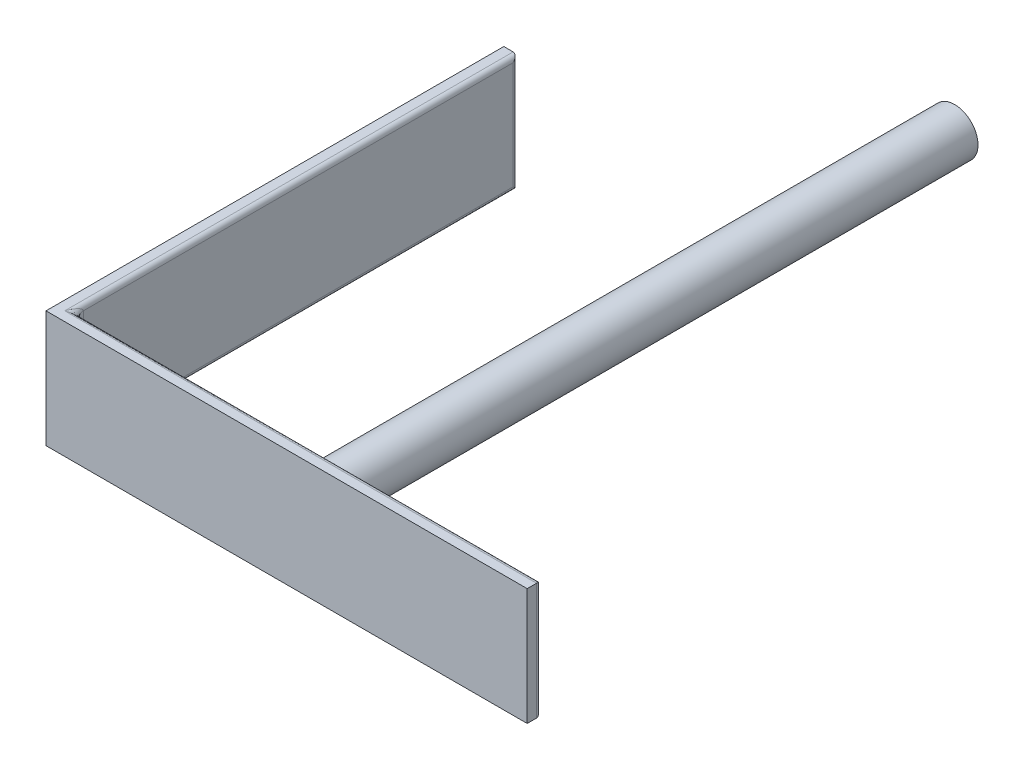
ISO-10303-21;
HEADER;
FILE_DESCRIPTION(('STEP AP214'),'2;1');
FILE_NAME('part.step','',(''),(''),'','','');
FILE_SCHEMA(('AUTOMOTIVE_DESIGN { 1 0 10303 214 1 1 1 1 }'));
ENDSEC;
DATA;
#1=APPLICATION_CONTEXT('core data for automotive mechanical design processes');
#2=APPLICATION_PROTOCOL_DEFINITION('international standard','automotive_design',2000,#1);
#3=PRODUCT_CONTEXT('',#1,'mechanical');
#4=PRODUCT('Part','Part','',(#3));
#5=PRODUCT_RELATED_PRODUCT_CATEGORY('part','',(#4));
#6=PRODUCT_DEFINITION_FORMATION('','',#4);
#7=PRODUCT_DEFINITION_CONTEXT('part definition',#1,'design');
#8=PRODUCT_DEFINITION('design','',#6,#7);
#9=PRODUCT_DEFINITION_SHAPE('','',#8);
#10=(LENGTH_UNIT() NAMED_UNIT(*) SI_UNIT(.MILLI.,.METRE.));
#11=(NAMED_UNIT(*) PLANE_ANGLE_UNIT() SI_UNIT($,.RADIAN.));
#12=(NAMED_UNIT(*) SI_UNIT($,.STERADIAN.) SOLID_ANGLE_UNIT());
#13=UNCERTAINTY_MEASURE_WITH_UNIT(LENGTH_MEASURE(1.E-05),#10,'distance_accuracy_value','');
#14=(GEOMETRIC_REPRESENTATION_CONTEXT(3) GLOBAL_UNCERTAINTY_ASSIGNED_CONTEXT((#13)) GLOBAL_UNIT_ASSIGNED_CONTEXT((#10,
#11,#12)) REPRESENTATION_CONTEXT('',''));
#15=CARTESIAN_POINT('',(0.,0.,0.));
#16=DIRECTION('',(0.,0.,1.));
#17=DIRECTION('',(1.,0.,0.));
#18=AXIS2_PLACEMENT_3D('',#15,#16,#17);
#19=CARTESIAN_POINT('',(0.,0.,140.));
#20=DIRECTION('',(0.,0.,-1.));
#21=DIRECTION('',(-1.,0.,0.));
#22=AXIS2_PLACEMENT_3D('',#19,#20,#21);
#23=CYLINDRICAL_SURFACE('',#22,5.);
#24=CARTESIAN_POINT('',(0.,0.,140.));
#25=DIRECTION('',(0.,0.,1.));
#26=DIRECTION('',(1.,0.,0.));
#27=AXIS2_PLACEMENT_3D('',#24,#25,#26);
#28=CIRCLE('',#27,5.);
#29=CARTESIAN_POINT('',(5.,0.,140.));
#30=VERTEX_POINT('',#29);
#31=EDGE_CURVE('E155',#30,#30,#28,.T.);
#32=ORIENTED_EDGE('',*,*,#31,.F.);
#33=EDGE_LOOP('',(#32));
#34=FACE_BOUND('',#33,.T.);
#35=CARTESIAN_POINT('',(0.,0.,0.));
#36=DIRECTION('',(0.,0.,1.));
#37=DIRECTION('',(1.,0.,0.));
#38=AXIS2_PLACEMENT_3D('',#35,#36,#37);
#39=CIRCLE('',#38,5.);
#40=CARTESIAN_POINT('',(5.,0.,0.));
#41=VERTEX_POINT('',#40);
#42=EDGE_CURVE('E152',#41,#41,#39,.T.);
#43=ORIENTED_EDGE('',*,*,#42,.T.);
#44=EDGE_LOOP('',(#43));
#45=FACE_BOUND('',#44,.T.);
#46=ADVANCED_FACE('F43',(#34,#45),#23,.T.);
#47=CARTESIAN_POINT('',(0.,0.,0.));
#48=DIRECTION('',(0.,0.,1.));
#49=DIRECTION('',(1.,0.,0.));
#50=AXIS2_PLACEMENT_3D('',#47,#48,#49);
#51=PLANE('',#50);
#52=ORIENTED_EDGE('',*,*,#42,.F.);
#53=EDGE_LOOP('',(#52));
#54=FACE_BOUND('',#53,.T.);
#55=ADVANCED_FACE('F240',(#54),#51,.F.);
#56=CARTESIAN_POINT('',(-48.5,12.5,45.));
#57=DIRECTION('',(0.,0.,1.));
#58=DIRECTION('',(1.,0.,0.));
#59=AXIS2_PLACEMENT_3D('',#56,#57,#58);
#60=PLANE('',#59);
#61=DIRECTION('',(-1.,0.,0.));
#62=VECTOR('',#61,1.);
#63=CARTESIAN_POINT('',(-48.5,12.5,45.));
#64=LINE('',#63,#62);
#65=CARTESIAN_POINT('',(-49.5,12.5,45.));
#66=VERTEX_POINT('',#65);
#67=CARTESIAN_POINT('',(-51.5,12.5,45.));
#68=VERTEX_POINT('',#67);
#69=EDGE_CURVE('E126',#66,#68,#64,.T.);
#70=ORIENTED_EDGE('',*,*,#69,.F.);
#71=DIRECTION('',(0.,-1.,0.));
#72=VECTOR('',#71,1.);
#73=CARTESIAN_POINT('',(-49.5,12.5,45.));
#74=LINE('',#73,#72);
#75=CARTESIAN_POINT('',(-49.5,-12.5,45.));
#76=VERTEX_POINT('',#75);
#77=EDGE_CURVE('E173',#66,#76,#74,.T.);
#78=ORIENTED_EDGE('',*,*,#77,.T.);
#79=DIRECTION('',(-1.,0.,0.));
#80=VECTOR('',#79,1.);
#81=CARTESIAN_POINT('',(-48.5,-12.5,45.));
#82=LINE('',#81,#80);
#83=CARTESIAN_POINT('',(-51.5,-12.5,45.));
#84=VERTEX_POINT('',#83);
#85=EDGE_CURVE('E150',#76,#84,#82,.T.);
#86=ORIENTED_EDGE('',*,*,#85,.T.);
#87=DIRECTION('',(0.,-1.,0.));
#88=VECTOR('',#87,1.);
#89=CARTESIAN_POINT('',(-51.5,12.5,45.));
#90=LINE('',#89,#88);
#91=EDGE_CURVE('E142',#68,#84,#90,.T.);
#92=ORIENTED_EDGE('',*,*,#91,.F.);
#93=EDGE_LOOP('',(#70,#78,#86,#92));
#94=FACE_BOUND('',#93,.T.);
#95=ADVANCED_FACE('F148',(#94),#60,.F.);
#96=CARTESIAN_POINT('',(-51.5,12.5,45.));
#97=DIRECTION('',(1.,0.,0.));
#98=DIRECTION('',(0.,0.,-1.));
#99=AXIS2_PLACEMENT_3D('',#96,#97,#98);
#100=PLANE('',#99);
#101=DIRECTION('',(0.,0.,1.));
#102=VECTOR('',#101,1.);
#103=CARTESIAN_POINT('',(-51.5,-12.5,45.));
#104=LINE('',#103,#102);
#105=CARTESIAN_POINT('',(-51.5,-12.5,143.));
#106=VERTEX_POINT('',#105);
#107=EDGE_CURVE('E289',#84,#106,#104,.T.);
#108=ORIENTED_EDGE('',*,*,#107,.T.);
#109=DIRECTION('',(0.,-1.,0.));
#110=VECTOR('',#109,1.);
#111=CARTESIAN_POINT('',(-51.5,12.5,143.));
#112=LINE('',#111,#110);
#113=CARTESIAN_POINT('',(-51.5,12.5,143.));
#114=VERTEX_POINT('',#113);
#115=EDGE_CURVE('E144',#114,#106,#112,.T.);
#116=ORIENTED_EDGE('',*,*,#115,.F.);
#117=DIRECTION('',(0.,0.,1.));
#118=VECTOR('',#117,1.);
#119=CARTESIAN_POINT('',(-51.5,12.5,45.));
#120=LINE('',#119,#118);
#121=EDGE_CURVE('E130',#68,#114,#120,.T.);
#122=ORIENTED_EDGE('',*,*,#121,.F.);
#123=ORIENTED_EDGE('',*,*,#91,.T.);
#124=EDGE_LOOP('',(#108,#116,#122,#123));
#125=FACE_BOUND('',#124,.T.);
#126=ADVANCED_FACE('F141',(#125),#100,.F.);
#127=CARTESIAN_POINT('',(-51.5,12.5,143.));
#128=DIRECTION('',(0.,0.,-1.));
#129=DIRECTION('',(-1.,0.,0.));
#130=AXIS2_PLACEMENT_3D('',#127,#128,#129);
#131=PLANE('',#130);
#132=DIRECTION('',(1.,0.,0.));
#133=VECTOR('',#132,1.);
#134=CARTESIAN_POINT('',(-51.5,-12.5,143.));
#135=LINE('',#134,#133);
#136=CARTESIAN_POINT('',(51.5,-12.5,143.));
#137=VERTEX_POINT('',#136);
#138=EDGE_CURVE('E291',#106,#137,#135,.T.);
#139=ORIENTED_EDGE('',*,*,#138,.T.);
#140=DIRECTION('',(0.,-1.,0.));
#141=VECTOR('',#140,1.);
#142=CARTESIAN_POINT('',(51.5,12.5,143.));
#143=LINE('',#142,#141);
#144=CARTESIAN_POINT('',(51.5,12.5,143.));
#145=VERTEX_POINT('',#144);
#146=EDGE_CURVE('E157',#145,#137,#143,.T.);
#147=ORIENTED_EDGE('',*,*,#146,.F.);
#148=DIRECTION('',(1.,0.,0.));
#149=VECTOR('',#148,1.);
#150=CARTESIAN_POINT('',(-51.5,12.5,143.));
#151=LINE('',#150,#149);
#152=EDGE_CURVE('E146',#114,#145,#151,.T.);
#153=ORIENTED_EDGE('',*,*,#152,.F.);
#154=ORIENTED_EDGE('',*,*,#115,.T.);
#155=EDGE_LOOP('',(#139,#147,#153,#154));
#156=FACE_BOUND('',#155,.T.);
#157=ADVANCED_FACE('F295',(#156),#131,.F.);
#158=CARTESIAN_POINT('',(51.5,12.5,143.));
#159=DIRECTION('',(-1.,0.,0.));
#160=DIRECTION('',(0.,0.,1.));
#161=AXIS2_PLACEMENT_3D('',#158,#159,#160);
#162=PLANE('',#161);
#163=DIRECTION('',(0.,0.,-1.));
#164=VECTOR('',#163,1.);
#165=CARTESIAN_POINT('',(51.5,-12.5,143.));
#166=LINE('',#165,#164);
#167=CARTESIAN_POINT('',(51.5,-12.5,141.));
#168=VERTEX_POINT('',#167);
#169=EDGE_CURVE('E137',#137,#168,#166,.T.);
#170=ORIENTED_EDGE('',*,*,#169,.T.);
#171=DIRECTION('',(0.,-1.,0.));
#172=VECTOR('',#171,1.);
#173=CARTESIAN_POINT('',(51.5,12.5,141.));
#174=LINE('',#173,#172);
#175=CARTESIAN_POINT('',(51.5,12.5,141.));
#176=VERTEX_POINT('',#175);
#177=EDGE_CURVE('E170',#168,#176,#174,.F.);
#178=ORIENTED_EDGE('',*,*,#177,.T.);
#179=DIRECTION('',(0.,0.,-1.));
#180=VECTOR('',#179,1.);
#181=CARTESIAN_POINT('',(51.5,12.5,143.));
#182=LINE('',#181,#180);
#183=EDGE_CURVE('E283',#145,#176,#182,.T.);
#184=ORIENTED_EDGE('',*,*,#183,.F.);
#185=ORIENTED_EDGE('',*,*,#146,.T.);
#186=EDGE_LOOP('',(#170,#178,#184,#185));
#187=FACE_BOUND('',#186,.T.);
#188=ADVANCED_FACE('F281',(#187),#162,.F.);
#189=CARTESIAN_POINT('',(51.5,12.5,140.));
#190=DIRECTION('',(0.,0.,1.));
#191=DIRECTION('',(1.,0.,0.));
#192=AXIS2_PLACEMENT_3D('',#189,#190,#191);
#193=PLANE('',#192);
#194=ORIENTED_EDGE('',*,*,#31,.T.);
#195=EDGE_LOOP('',(#194));
#196=FACE_BOUND('',#195,.T.);
#197=DIRECTION('',(-1.,0.,0.));
#198=VECTOR('',#197,1.);
#199=CARTESIAN_POINT('',(51.5,-11.5,140.));
#200=LINE('',#199,#198);
#201=CARTESIAN_POINT('',(50.5,-11.5,140.));
#202=VERTEX_POINT('',#201);
#203=CARTESIAN_POINT('',(-46.5,-11.5,140.));
#204=VERTEX_POINT('',#203);
#205=EDGE_CURVE('E168',#202,#204,#200,.T.);
#206=ORIENTED_EDGE('',*,*,#205,.T.);
#207=DIRECTION('',(0.,-1.,0.));
#208=VECTOR('',#207,1.);
#209=CARTESIAN_POINT('',(-46.5,11.5,140.));
#210=LINE('',#209,#208);
#211=CARTESIAN_POINT('',(-46.5,11.5,140.));
#212=VERTEX_POINT('',#211);
#213=EDGE_CURVE('E11',#204,#212,#210,.F.);
#214=ORIENTED_EDGE('',*,*,#213,.T.);
#215=DIRECTION('',(-1.,0.,0.));
#216=VECTOR('',#215,1.);
#217=CARTESIAN_POINT('',(51.5,11.5,140.));
#218=LINE('',#217,#216);
#219=CARTESIAN_POINT('',(50.5,11.5,140.));
#220=VERTEX_POINT('',#219);
#221=EDGE_CURVE('E162',#212,#220,#218,.F.);
#222=ORIENTED_EDGE('',*,*,#221,.T.);
#223=DIRECTION('',(0.,-1.,0.));
#224=VECTOR('',#223,1.);
#225=CARTESIAN_POINT('',(50.5,12.5,140.));
#226=LINE('',#225,#224);
#227=EDGE_CURVE('E165',#220,#202,#226,.T.);
#228=ORIENTED_EDGE('',*,*,#227,.T.);
#229=EDGE_LOOP('',(#206,#214,#222,#228));
#230=FACE_BOUND('',#229,.T.);
#231=ADVANCED_FACE('F273',(#196,#230),#193,.F.);
#232=CARTESIAN_POINT('',(-48.5,12.5,140.));
#233=DIRECTION('',(-1.,0.,0.));
#234=DIRECTION('',(0.,0.,1.));
#235=AXIS2_PLACEMENT_3D('',#232,#233,#234);
#236=PLANE('',#235);
#237=DIRECTION('',(0.,0.,-1.));
#238=VECTOR('',#237,1.);
#239=CARTESIAN_POINT('',(-48.5,11.5,140.));
#240=LINE('',#239,#238);
#241=CARTESIAN_POINT('',(-48.5,11.5,46.));
#242=VERTEX_POINT('',#241);
#243=CARTESIAN_POINT('',(-48.5,11.5,138.));
#244=VERTEX_POINT('',#243);
#245=EDGE_CURVE('E175',#242,#244,#240,.F.);
#246=ORIENTED_EDGE('',*,*,#245,.T.);
#247=DIRECTION('',(0.,-1.,0.));
#248=VECTOR('',#247,1.);
#249=CARTESIAN_POINT('',(-48.5,-11.5,138.));
#250=LINE('',#249,#248);
#251=CARTESIAN_POINT('',(-48.5,-11.5,138.));
#252=VERTEX_POINT('',#251);
#253=EDGE_CURVE('E56',#244,#252,#250,.T.);
#254=ORIENTED_EDGE('',*,*,#253,.T.);
#255=DIRECTION('',(0.,0.,-1.));
#256=VECTOR('',#255,1.);
#257=CARTESIAN_POINT('',(-48.5,-11.5,140.));
#258=LINE('',#257,#256);
#259=CARTESIAN_POINT('',(-48.5,-11.5,46.));
#260=VERTEX_POINT('',#259);
#261=EDGE_CURVE('E179',#252,#260,#258,.T.);
#262=ORIENTED_EDGE('',*,*,#261,.T.);
#263=DIRECTION('',(0.,-1.,0.));
#264=VECTOR('',#263,1.);
#265=CARTESIAN_POINT('',(-48.5,12.5,46.));
#266=LINE('',#265,#264);
#267=EDGE_CURVE('E177',#260,#242,#266,.F.);
#268=ORIENTED_EDGE('',*,*,#267,.T.);
#269=EDGE_LOOP('',(#246,#254,#262,#268));
#270=FACE_BOUND('',#269,.T.);
#271=ADVANCED_FACE('F305',(#270),#236,.F.);
#272=CARTESIAN_POINT('',(0.,12.5,0.));
#273=DIRECTION('',(0.,1.,0.));
#274=DIRECTION('',(0.,0.,1.));
#275=AXIS2_PLACEMENT_3D('',#272,#273,#274);
#276=PLANE('',#275);
#277=DIRECTION('',(-1.,0.,0.));
#278=VECTOR('',#277,1.);
#279=CARTESIAN_POINT('',(-48.5,12.5,141.));
#280=LINE('',#279,#278);
#281=CARTESIAN_POINT('',(-49.5,12.5,141.));
#282=VERTEX_POINT('',#281);
#283=EDGE_CURVE('E186',#176,#282,#280,.T.);
#284=ORIENTED_EDGE('',*,*,#283,.T.);
#285=DIRECTION('',(0.,0.,-1.));
#286=VECTOR('',#285,1.);
#287=CARTESIAN_POINT('',(-49.5,12.5,45.));
#288=LINE('',#287,#286);
#289=EDGE_CURVE('E133',#282,#66,#288,.T.);
#290=ORIENTED_EDGE('',*,*,#289,.T.);
#291=ORIENTED_EDGE('',*,*,#69,.T.);
#292=ORIENTED_EDGE('',*,*,#121,.T.);
#293=ORIENTED_EDGE('',*,*,#152,.T.);
#294=ORIENTED_EDGE('',*,*,#183,.T.);
#295=EDGE_LOOP('',(#284,#290,#291,#292,#293,#294));
#296=FACE_BOUND('',#295,.T.);
#297=ADVANCED_FACE('F129',(#296),#276,.T.);
#298=CARTESIAN_POINT('',(0.,-12.5,0.));
#299=DIRECTION('',(0.,1.,0.));
#300=DIRECTION('',(0.,0.,1.));
#301=AXIS2_PLACEMENT_3D('',#298,#299,#300);
#302=PLANE('',#301);
#303=DIRECTION('',(0.,0.,-1.));
#304=VECTOR('',#303,1.);
#305=CARTESIAN_POINT('',(-49.5,-12.5,0.));
#306=LINE('',#305,#304);
#307=CARTESIAN_POINT('',(-49.5,-12.5,141.));
#308=VERTEX_POINT('',#307);
#309=EDGE_CURVE('E181',#76,#308,#306,.F.);
#310=ORIENTED_EDGE('',*,*,#309,.T.);
#311=DIRECTION('',(-1.,0.,0.));
#312=VECTOR('',#311,1.);
#313=CARTESIAN_POINT('',(0.,-12.5,141.));
#314=LINE('',#313,#312);
#315=EDGE_CURVE('E184',#308,#168,#314,.F.);
#316=ORIENTED_EDGE('',*,*,#315,.T.);
#317=ORIENTED_EDGE('',*,*,#169,.F.);
#318=ORIENTED_EDGE('',*,*,#138,.F.);
#319=ORIENTED_EDGE('',*,*,#107,.F.);
#320=ORIENTED_EDGE('',*,*,#85,.F.);
#321=EDGE_LOOP('',(#310,#316,#317,#318,#319,#320));
#322=FACE_BOUND('',#321,.T.);
#323=ADVANCED_FACE('F296',(#322),#302,.F.);
#324=CARTESIAN_POINT('',(-49.5,12.5,46.));
#325=DIRECTION('',(0.,-1.,0.));
#326=DIRECTION('',(0.,0.,-1.));
#327=AXIS2_PLACEMENT_3D('',#324,#325,#326);
#328=CYLINDRICAL_SURFACE('',#327,1.);
#329=CARTESIAN_POINT('',(-49.5,-11.5,46.));
#330=DIRECTION('',(0.,0.707106781186547,-0.707106781186547));
#331=DIRECTION('',(0.,-0.707106781186547,-0.707106781186547));
#332=AXIS2_PLACEMENT_3D('',#329,#330,#331);
#333=ELLIPSE('',#332,1.41421356237309,1.);
#334=EDGE_CURVE('E195',#76,#260,#333,.F.);
#335=ORIENTED_EDGE('',*,*,#334,.F.);
#336=ORIENTED_EDGE('',*,*,#77,.F.);
#337=CARTESIAN_POINT('',(-49.5,11.5,46.));
#338=DIRECTION('',(0.,0.707106781186547,0.707106781186547));
#339=DIRECTION('',(0.,-0.707106781186547,0.707106781186547));
#340=AXIS2_PLACEMENT_3D('',#337,#338,#339);
#341=ELLIPSE('',#340,1.41421356237309,1.);
#342=EDGE_CURVE('E198',#242,#66,#341,.T.);
#343=ORIENTED_EDGE('',*,*,#342,.F.);
#344=ORIENTED_EDGE('',*,*,#267,.F.);
#345=EDGE_LOOP('',(#335,#336,#343,#344));
#346=FACE_BOUND('',#345,.T.);
#347=ADVANCED_FACE('F223',(#346),#328,.T.);
#348=CARTESIAN_POINT('',(-49.5,11.5,0.));
#349=DIRECTION('',(0.,0.,1.));
#350=DIRECTION('',(1.,0.,0.));
#351=AXIS2_PLACEMENT_3D('',#348,#349,#350);
#352=CYLINDRICAL_SURFACE('',#351,1.);
#353=ORIENTED_EDGE('',*,*,#289,.F.);
#354=CARTESIAN_POINT('',(-49.5,11.5,141.));
#355=DIRECTION('',(-0.948683298050514,0.,-0.316227766016838));
#356=DIRECTION('',(0.316227766016838,0.,-0.948683298050514));
#357=AXIS2_PLACEMENT_3D('',#354,#355,#356);
#358=ELLIPSE('',#357,3.16227766016838,1.);
#359=EDGE_CURVE('E203',#282,#244,#358,.T.);
#360=ORIENTED_EDGE('',*,*,#359,.T.);
#361=ORIENTED_EDGE('',*,*,#245,.F.);
#362=ORIENTED_EDGE('',*,*,#342,.T.);
#363=EDGE_LOOP('',(#353,#360,#361,#362));
#364=FACE_BOUND('',#363,.T.);
#365=ADVANCED_FACE('F226',(#364),#352,.T.);
#366=CARTESIAN_POINT('',(-49.5,-11.5,140.));
#367=DIRECTION('',(0.,0.,-1.));
#368=DIRECTION('',(-1.,0.,0.));
#369=AXIS2_PLACEMENT_3D('',#366,#367,#368);
#370=CYLINDRICAL_SURFACE('',#369,1.);
#371=ORIENTED_EDGE('',*,*,#261,.F.);
#372=CARTESIAN_POINT('',(-49.5,-11.5,141.));
#373=DIRECTION('',(0.948683298050514,0.,0.316227766016838));
#374=DIRECTION('',(-0.316227766016838,0.,0.948683298050514));
#375=AXIS2_PLACEMENT_3D('',#372,#373,#374);
#376=ELLIPSE('',#375,3.16227766016838,1.);
#377=EDGE_CURVE('E206',#252,#308,#376,.F.);
#378=ORIENTED_EDGE('',*,*,#377,.T.);
#379=ORIENTED_EDGE('',*,*,#309,.F.);
#380=ORIENTED_EDGE('',*,*,#334,.T.);
#381=EDGE_LOOP('',(#371,#378,#379,#380));
#382=FACE_BOUND('',#381,.T.);
#383=ADVANCED_FACE('F229',(#382),#370,.T.);
#384=CARTESIAN_POINT('',(0.,11.5,141.));
#385=DIRECTION('',(1.,0.,0.));
#386=DIRECTION('',(0.,0.,-1.));
#387=AXIS2_PLACEMENT_3D('',#384,#385,#386);
#388=CYLINDRICAL_SURFACE('',#387,1.);
#389=ORIENTED_EDGE('',*,*,#221,.F.);
#390=CARTESIAN_POINT('',(-49.5,11.5,141.));
#391=DIRECTION('',(-0.316227766016838,0.,-0.948683298050514));
#392=DIRECTION('',(0.948683298050514,0.,-0.316227766016838));
#393=AXIS2_PLACEMENT_3D('',#390,#391,#392);
#394=ELLIPSE('',#393,3.16227766016838,1.);
#395=EDGE_CURVE('E189',#212,#282,#394,.F.);
#396=ORIENTED_EDGE('',*,*,#395,.T.);
#397=ORIENTED_EDGE('',*,*,#283,.F.);
#398=CARTESIAN_POINT('',(50.5,11.5,141.));
#399=DIRECTION('',(0.707106781186547,-0.707106781186547,0.));
#400=DIRECTION('',(0.707106781186547,0.707106781186547,0.));
#401=AXIS2_PLACEMENT_3D('',#398,#399,#400);
#402=ELLIPSE('',#401,1.41421356237309,1.);
#403=EDGE_CURVE('E192',#220,#176,#402,.T.);
#404=ORIENTED_EDGE('',*,*,#403,.F.);
#405=EDGE_LOOP('',(#389,#396,#397,#404));
#406=FACE_BOUND('',#405,.T.);
#407=ADVANCED_FACE('F224',(#406),#388,.T.);
#408=CARTESIAN_POINT('',(51.5,-11.5,141.));
#409=DIRECTION('',(-1.,0.,0.));
#410=DIRECTION('',(0.,0.,1.));
#411=AXIS2_PLACEMENT_3D('',#408,#409,#410);
#412=CYLINDRICAL_SURFACE('',#411,1.);
#413=ORIENTED_EDGE('',*,*,#315,.F.);
#414=CARTESIAN_POINT('',(-49.5,-11.5,141.));
#415=DIRECTION('',(0.316227766016838,0.,0.948683298050514));
#416=DIRECTION('',(-0.948683298050514,0.,0.316227766016838));
#417=AXIS2_PLACEMENT_3D('',#414,#415,#416);
#418=ELLIPSE('',#417,3.16227766016838,1.);
#419=EDGE_CURVE('E71',#308,#204,#418,.T.);
#420=ORIENTED_EDGE('',*,*,#419,.T.);
#421=ORIENTED_EDGE('',*,*,#205,.F.);
#422=CARTESIAN_POINT('',(50.5,-11.5,141.));
#423=DIRECTION('',(-0.707106781186547,-0.707106781186547,0.));
#424=DIRECTION('',(-0.707106781186547,0.707106781186547,0.));
#425=AXIS2_PLACEMENT_3D('',#422,#423,#424);
#426=ELLIPSE('',#425,1.41421356237309,1.);
#427=EDGE_CURVE('E190',#168,#202,#426,.F.);
#428=ORIENTED_EDGE('',*,*,#427,.F.);
#429=EDGE_LOOP('',(#413,#420,#421,#428));
#430=FACE_BOUND('',#429,.T.);
#431=ADVANCED_FACE('F237',(#430),#412,.T.);
#432=CARTESIAN_POINT('',(50.5,12.5,141.));
#433=DIRECTION('',(0.,-1.,0.));
#434=DIRECTION('',(0.,0.,-1.));
#435=AXIS2_PLACEMENT_3D('',#432,#433,#434);
#436=CYLINDRICAL_SURFACE('',#435,1.);
#437=ORIENTED_EDGE('',*,*,#403,.T.);
#438=ORIENTED_EDGE('',*,*,#177,.F.);
#439=ORIENTED_EDGE('',*,*,#427,.T.);
#440=ORIENTED_EDGE('',*,*,#227,.F.);
#441=EDGE_LOOP('',(#437,#438,#439,#440));
#442=FACE_BOUND('',#441,.T.);
#443=ADVANCED_FACE('F252',(#442),#436,.T.);
#444=CARTESIAN_POINT('',(-49.5,-10.5,141.));
#445=CARTESIAN_POINT('',(-49.5,-10.5,141.));
#446=CARTESIAN_POINT('',(-49.5,-10.5,141.));
#447=CARTESIAN_POINT('',(-49.4564352528962,-10.500017527625,140.869305758689));
#448=CARTESIAN_POINT('',(-49.4128524686187,-10.4997795771423,140.912852468619));
#449=CARTESIAN_POINT('',(-49.3693057586886,-10.500017527625,140.956435252896));
#450=CARTESIAN_POINT('',(-49.4128593822092,-10.5028482437154,140.738578146628));
#451=CARTESIAN_POINT('',(-49.325466253988,-10.5085448704797,140.825466253988));
#452=CARTESIAN_POINT('',(-49.2385781466275,-10.5028482437154,140.912859382209));
#453=CARTESIAN_POINT('',(-49.3264570060638,-10.5142135255445,140.479371018191));
#454=CARTESIAN_POINT('',(-49.154914565138,-10.5425898766347,140.654914565138));
#455=CARTESIAN_POINT('',(-48.9793710181915,-10.5142135255444,140.826457006064));
#456=CARTESIAN_POINT('',(-49.2836272793586,-10.5226994046609,140.350881838076));
#457=CARTESIAN_POINT('',(-49.071254735473,-10.5679189436801,140.571254735473));
#458=CARTESIAN_POINT('',(-48.8508818380759,-10.5226994046609,140.783627279359));
#459=CARTESIAN_POINT('',(-49.1994465807018,-10.5452581542781,140.098339742105));
#460=CARTESIAN_POINT('',(-48.9118573709985,-10.6339372023646,140.411857370999));
#461=CARTESIAN_POINT('',(-48.5983397421054,-10.5452581542781,140.699446580702));
#462=CARTESIAN_POINT('',(-49.1580828550368,-10.5592349270778,139.97424856511));
#463=CARTESIAN_POINT('',(-48.8356315333065,-10.6747238565637,140.335631533307));
#464=CARTESIAN_POINT('',(-48.4742485651103,-10.5592349270778,140.658082855037));
#465=CARTESIAN_POINT('',(-49.0775545330133,-10.5925900428466,139.73266359904));
#466=CARTESIAN_POINT('',(-48.6946914299249,-10.7691021892956,140.194691429925));
#467=CARTESIAN_POINT('',(-48.2326635990399,-10.5925900428466,140.577554533013));
#468=CARTESIAN_POINT('',(-49.0383608641533,-10.6118268395572,139.61508259246));
#469=CARTESIAN_POINT('',(-48.6295042961266,-10.8228410716445,140.129504296127));
#470=CARTESIAN_POINT('',(-48.11508259246,-10.6118268395572,140.538360864153));
#471=CARTESIAN_POINT('',(-48.9628601646601,-10.6554173883319,139.38858049398));
#472=CARTESIAN_POINT('',(-48.5139754381342,-10.9393518968129,140.013975438134));
#473=CARTESIAN_POINT('',(-47.8885804939802,-10.6554173883319,140.46286016466));
#474=CARTESIAN_POINT('',(-48.9265009613289,-10.6795887775531,139.279502883987));
#475=CARTESIAN_POINT('',(-48.4631874729458,-11.0023175888339,139.963187472946));
#476=CARTESIAN_POINT('',(-47.7795028839866,-10.6795887775531,140.426500961329));
#477=CARTESIAN_POINT('',(-48.8573159233545,-10.732676517395,139.071947770064));
#478=CARTESIAN_POINT('',(-48.379219560621,-11.1318970211743,139.879219560621));
#479=CARTESIAN_POINT('',(-47.5719477700636,-10.732676517395,140.357315923355));
#480=CARTESIAN_POINT('',(-48.8244083283744,-10.7613776985779,138.973224985123));
#481=CARTESIAN_POINT('',(-48.3456343514131,-11.1987435238427,139.845634351413));
#482=CARTESIAN_POINT('',(-47.4732249851231,-10.7613776985779,140.324408328374));
#483=CARTESIAN_POINT('',(-48.7627207197245,-10.8230661110814,138.788162159174));
#484=CARTESIAN_POINT('',(-48.2976897327736,-11.3289107147676,139.797689732774));
#485=CARTESIAN_POINT('',(-47.2881621591736,-10.8230661110814,140.262720719725));
#486=CARTESIAN_POINT('',(-48.733824587672,-10.8558186566414,138.701473763016));
#487=CARTESIAN_POINT('',(-48.2829794724077,-11.3924895411015,139.782979472408));
#488=CARTESIAN_POINT('',(-47.201473763016,-10.8558186566414,140.233824587672));
#489=CARTESIAN_POINT('',(-48.6806903266688,-10.925066429184,138.542070980006));
#490=CARTESIAN_POINT('',(-48.2723437162998,-11.5073464346158,139.7723437163));
#491=CARTESIAN_POINT('',(-47.0420709800064,-10.925066429184,140.180690326669));
#492=CARTESIAN_POINT('',(-48.6563012091989,-10.9613272590618,138.468903627597));
#493=CARTESIAN_POINT('',(-48.2761283893674,-11.5588927995415,139.776128389367));
#494=CARTESIAN_POINT('',(-46.9689036275967,-10.9613272590618,140.156301209199));
#495=CARTESIAN_POINT('',(-48.6126340185669,-11.0369647931593,138.337902055701));
#496=CARTESIAN_POINT('',(-48.2988310796452,-11.6404982857835,139.798831079645));
#497=CARTESIAN_POINT('',(-46.8379020557008,-11.0369647931593,140.112634018567));
#498=CARTESIAN_POINT('',(-48.5931777908445,-11.0761331618542,138.279533372534));
#499=CARTESIAN_POINT('',(-48.3175148820438,-11.6708310275746,139.817514882044));
#500=CARTESIAN_POINT('',(-46.7795333725336,-11.0761331618542,140.093177790845));
#501=CARTESIAN_POINT('',(-48.5597347362444,-11.156878473379,138.179204208733));
#502=CARTESIAN_POINT('',(-48.3623655193431,-11.7032508751517,139.862365519343));
#503=CARTESIAN_POINT('',(-46.6792042087331,-11.156878473379,140.059734736244));
#504=CARTESIAN_POINT('',(-48.5455627256935,-11.1982998652105,138.13668817708));
#505=CARTESIAN_POINT('',(-48.3883400650963,-11.7056378280083,139.888340065096));
#506=CARTESIAN_POINT('',(-46.6366881770804,-11.1982998652105,140.045562725693));
#507=CARTESIAN_POINT('',(-48.5229305825533,-11.2827744762214,138.06879174766));
#508=CARTESIAN_POINT('',(-48.4369949485768,-11.6821250445098,139.936994948577));
#509=CARTESIAN_POINT('',(-46.5687917476599,-11.2827744762214,140.022930582553));
#510=CARTESIAN_POINT('',(-48.5143117196901,-11.3257413522602,138.04293515907));
#511=CARTESIAN_POINT('',(-48.4595211737965,-11.6565951877165,139.959521173797));
#512=CARTESIAN_POINT('',(-46.5429351590702,-11.3257413522602,140.01431171969));
#513=CARTESIAN_POINT('',(-48.5028930035072,-11.4124887622276,138.008679010522));
#514=CARTESIAN_POINT('',(-48.491070177907,-11.5871529644936,139.991070177907));
#515=CARTESIAN_POINT('',(-46.5086790105217,-11.4124887622276,140.002893003507));
#516=CARTESIAN_POINT('',(-48.5,-11.4562443811138,138.));
#517=CARTESIAN_POINT('',(-48.5,-11.5437036425927,140.));
#518=CARTESIAN_POINT('',(-46.5,-11.4562443811138,140.));
#519=CARTESIAN_POINT('',(-48.5,-11.5437556188862,138.));
#520=CARTESIAN_POINT('',(-48.5,-11.4562963574073,140.));
#521=CARTESIAN_POINT('',(-46.5,-11.5437556188862,140.));
#522=CARTESIAN_POINT('',(-48.5028930035072,-11.5875112377724,138.008679010522));
#523=CARTESIAN_POINT('',(-48.491070177907,-11.4128470355064,139.991070177907));
#524=CARTESIAN_POINT('',(-46.5086790105217,-11.5875112377724,140.002893003507));
#525=CARTESIAN_POINT('',(-48.5143117196901,-11.6742586477398,138.04293515907));
#526=CARTESIAN_POINT('',(-48.4595211737965,-11.3434048122835,139.959521173797));
#527=CARTESIAN_POINT('',(-46.5429351590702,-11.6742586477398,140.01431171969));
#528=CARTESIAN_POINT('',(-48.5229305825533,-11.7172255237786,138.06879174766));
#529=CARTESIAN_POINT('',(-48.4369949485768,-11.3178749554902,139.936994948577));
#530=CARTESIAN_POINT('',(-46.5687917476599,-11.7172255237786,140.022930582553));
#531=CARTESIAN_POINT('',(-48.5455627256935,-11.8017001347895,138.13668817708));
#532=CARTESIAN_POINT('',(-48.3883400650963,-11.2943621719917,139.888340065096));
#533=CARTESIAN_POINT('',(-46.6366881770804,-11.8017001347895,140.045562725693));
#534=CARTESIAN_POINT('',(-48.5597347362444,-11.843121526621,138.179204208733));
#535=CARTESIAN_POINT('',(-48.3623655193431,-11.2967491248483,139.862365519343));
#536=CARTESIAN_POINT('',(-46.6792042087331,-11.843121526621,140.059734736244));
#537=CARTESIAN_POINT('',(-48.5931777908445,-11.9238668381458,138.279533372534));
#538=CARTESIAN_POINT('',(-48.3175148820438,-11.3291689724254,139.817514882044));
#539=CARTESIAN_POINT('',(-46.7795333725336,-11.9238668381458,140.093177790845));
#540=CARTESIAN_POINT('',(-48.6126340185669,-11.9630352068407,138.337902055701));
#541=CARTESIAN_POINT('',(-48.2988310796452,-11.3595017142165,139.798831079645));
#542=CARTESIAN_POINT('',(-46.8379020557008,-11.9630352068407,140.112634018567));
#543=CARTESIAN_POINT('',(-48.6563012091989,-12.0386727409382,138.468903627597));
#544=CARTESIAN_POINT('',(-48.2761283893674,-11.4411072004585,139.776128389367));
#545=CARTESIAN_POINT('',(-46.9689036275967,-12.0386727409382,140.156301209199));
#546=CARTESIAN_POINT('',(-48.6806903266688,-12.074933570816,138.542070980006));
#547=CARTESIAN_POINT('',(-48.2723437162998,-11.4926535653842,139.7723437163));
#548=CARTESIAN_POINT('',(-47.0420709800064,-12.074933570816,140.180690326669));
#549=CARTESIAN_POINT('',(-48.733824587672,-12.1441813433586,138.701473763016));
#550=CARTESIAN_POINT('',(-48.2829794724076,-11.6075104588985,139.782979472408));
#551=CARTESIAN_POINT('',(-47.201473763016,-12.1441813433586,140.233824587672));
#552=CARTESIAN_POINT('',(-48.7627207197245,-12.1769338889186,138.788162159174));
#553=CARTESIAN_POINT('',(-48.2976897327736,-11.6710892852324,139.797689732774));
#554=CARTESIAN_POINT('',(-47.2881621591736,-12.1769338889186,140.262720719725));
#555=CARTESIAN_POINT('',(-48.8244083283744,-12.2386223014221,138.973224985123));
#556=CARTESIAN_POINT('',(-48.3456343514131,-11.8012564761573,139.845634351413));
#557=CARTESIAN_POINT('',(-47.4732249851231,-12.2386223014221,140.324408328374));
#558=CARTESIAN_POINT('',(-48.8573159233545,-12.267323482605,139.071947770064));
#559=CARTESIAN_POINT('',(-48.379219560621,-11.8681029788257,139.879219560621));
#560=CARTESIAN_POINT('',(-47.5719477700636,-12.267323482605,140.357315923355));
#561=CARTESIAN_POINT('',(-48.9265009613289,-12.3204112224469,139.279502883987));
#562=CARTESIAN_POINT('',(-48.4631874729458,-11.9976824111661,139.963187472946));
#563=CARTESIAN_POINT('',(-47.7795028839866,-12.3204112224469,140.426500961329));
#564=CARTESIAN_POINT('',(-48.9628601646601,-12.3445826116681,139.38858049398));
#565=CARTESIAN_POINT('',(-48.5139754381342,-12.0606481031871,140.013975438134));
#566=CARTESIAN_POINT('',(-47.8885804939802,-12.3445826116681,140.46286016466));
#567=CARTESIAN_POINT('',(-49.0383608641533,-12.3881731604428,139.61508259246));
#568=CARTESIAN_POINT('',(-48.6295042961266,-12.1771589283555,140.129504296127));
#569=CARTESIAN_POINT('',(-48.11508259246,-12.3881731604428,140.538360864153));
#570=CARTESIAN_POINT('',(-49.0775545330133,-12.4074099571534,139.73266359904));
#571=CARTESIAN_POINT('',(-48.6946914299249,-12.2308978107044,140.194691429925));
#572=CARTESIAN_POINT('',(-48.2326635990399,-12.4074099571534,140.577554533013));
#573=CARTESIAN_POINT('',(-49.1580828550368,-12.4407650729222,139.97424856511));
#574=CARTESIAN_POINT('',(-48.8356315333065,-12.3252761434363,140.335631533306));
#575=CARTESIAN_POINT('',(-48.4742485651103,-12.4407650729222,140.658082855037));
#576=CARTESIAN_POINT('',(-49.1994465807018,-12.4547418457219,140.098339742105));
#577=CARTESIAN_POINT('',(-48.9118573709985,-12.3660627976354,140.411857370999));
#578=CARTESIAN_POINT('',(-48.5983397421054,-12.4547418457219,140.699446580702));
#579=CARTESIAN_POINT('',(-49.2836272793586,-12.4773005953391,140.350881838076));
#580=CARTESIAN_POINT('',(-49.071254735473,-12.4320810563199,140.571254735473));
#581=CARTESIAN_POINT('',(-48.8508818380759,-12.4773005953391,140.783627279359));
#582=CARTESIAN_POINT('',(-49.3264570060638,-12.4857864744555,140.479371018191));
#583=CARTESIAN_POINT('',(-49.154914565138,-12.4574101233653,140.654914565138));
#584=CARTESIAN_POINT('',(-48.9793710181915,-12.4857864744555,140.826457006064));
#585=CARTESIAN_POINT('',(-49.4128593822092,-12.4971517562846,140.738578146628));
#586=CARTESIAN_POINT('',(-49.325466253988,-12.4914551295203,140.825466253988));
#587=CARTESIAN_POINT('',(-49.2385781466275,-12.4971517562846,140.912859382209));
#588=CARTESIAN_POINT('',(-49.4564352528962,-12.499982472375,140.869305758689));
#589=CARTESIAN_POINT('',(-49.4128524686187,-12.5002204228577,140.912852468619));
#590=CARTESIAN_POINT('',(-49.3693057586886,-12.499982472375,140.956435252896));
#591=CARTESIAN_POINT('',(-49.5,-12.5,141.));
#592=CARTESIAN_POINT('',(-49.5,-12.5,141.));
#593=CARTESIAN_POINT('',(-49.5,-12.5,141.));
#594=(BOUNDED_SURFACE() B_SPLINE_SURFACE(3,2,((#444,#445,#446),(#447,#448,#449),(#450,#451,
#452),(#453,#454,#455),(#456,#457,#458),(#459,#460,#461),(#462,#463,#464),(#465,#466,#467),
(#468,#469,#470),(#471,#472,#473),(#474,#475,#476),(#477,#478,#479),(#480,#481,#482),(#483,#484,
#485),(#486,#487,#488),(#489,#490,#491),(#492,#493,#494),(#495,#496,#497),(#498,#499,#500),
(#501,#502,#503),(#504,#505,#506),(#507,#508,#509),(#510,#511,#512),(#513,#514,#515),(#516,#517,
#518),(#519,#520,#521),(#522,#523,#524),(#525,#526,#527),(#528,#529,#530),(#531,#532,#533),
(#534,#535,#536),(#537,#538,#539),(#540,#541,#542),(#543,#544,#545),(#546,#547,#548),(#549,#550,
#551),(#552,#553,#554),(#555,#556,#557),(#558,#559,#560),(#561,#562,#563),(#564,#565,#566),
(#567,#568,#569),(#570,#571,#572),(#573,#574,#575),(#576,#577,#578),(#579,#580,#581),(#582,#583,
#584),(#585,#586,#587),(#588,#589,#590),(#591,#592,#593)),.UNSPECIFIED.,.F.,.F.,
.F.) B_SPLINE_SURFACE_WITH_KNOTS((4,2,2,2,2,2,2,2,2,2,2,2,2,2,2,2,2,2,2,2,2,2,2,2,4),(3,3),(0.,
0.554370162410113,1.10402823810618,1.64446692395205,2.17159223035095,2.68193910379252,
3.17289609776066,3.64293728307105,4.09185103267409,4.5209388991631,4.93313243702541,
5.33294925212492,5.72620643113585,6.11946361014678,6.51928042524629,6.9314739631086,
7.36056182959761,7.80947557920064,8.27951676451104,8.77047375847918,9.28082063192075,
9.80794593831966,10.3483846241655,10.8980426998616,11.4524128622717),(0.,1.),
.UNSPECIFIED.) GEOMETRIC_REPRESENTATION_ITEM() RATIONAL_B_SPLINE_SURFACE(((1.,1.,1.),(1.,
1.00000566557019,1.),(1.,0.998576699090688,1.),(1.,0.992910721279765,1.),(1.,0.988697681267575,
1.),(1.,0.97761712883305,1.),(1.,0.970795325018432,1.),(1.,0.954789124900481,1.),(1.,
0.94566706946563,1.),(1.,0.92548796875733,1.),(1.,0.914501756375307,1.),(1.,0.891169998194025,
1.),(1.,0.878891956959708,1.),(1.,0.853706993048538,1.),(1.,0.84084914596985,1.),(1.,
0.815387454422431,1.),(1.,0.802798170091792,1.),(1.,0.778880732263429,1.),(1.,0.767521437046521,
1.),(1.,0.747118526989835,1.),(1.,0.738001346912332,1.),(1.,0.723039691293395,1.),(1.,
0.717105167896984,1.),(1.,0.709170186451793,1.),(1.,0.707106781186548,1.),(1.,0.707106781186548,
1.),(1.,0.709170186451793,1.),(1.,0.717105167896984,1.),(1.,0.723039691293395,1.),(1.,
0.738001346912332,1.),(1.,0.747118526989835,1.),(1.,0.767521437046521,1.),(1.,0.778880732263429,
1.),(1.,0.802798170091791,1.),(1.,0.815387454422431,1.),(1.,0.84084914596985,1.),(1.,
0.853706993048538,1.),(1.,0.878891956959708,1.),(1.,0.891169998194025,1.),(1.,0.914501756375307,
1.),(1.,0.92548796875733,1.),(1.,0.94566706946563,1.),(1.,0.954789124900481,1.),(1.,
0.970795325018432,1.),(1.,0.97761712883305,1.),(1.,0.988697681267575,1.),(1.,0.992910721279765,
1.),(1.,0.998576699090688,1.),(1.,1.00000566557019,1.),(1.,1.,1.))) REPRESENTATION_ITEM('') SURFACE());
#595=ORIENTED_EDGE('',*,*,#419,.F.);
#596=ORIENTED_EDGE('',*,*,#377,.F.);
#597=CARTESIAN_POINT('',(-46.5,-11.5,138.));
#598=DIRECTION('',(0.,-1.,0.));
#599=DIRECTION('',(0.,0.,-1.));
#600=AXIS2_PLACEMENT_3D('',#597,#598,#599);
#601=CIRCLE('',#600,2.);
#602=EDGE_CURVE('E193',#204,#252,#601,.T.);
#603=ORIENTED_EDGE('',*,*,#602,.F.);
#604=EDGE_LOOP('',(#595,#596,#603));
#605=FACE_BOUND('',#604,.T.);
#606=ADVANCED_FACE('F45',(#605),#594,.F.);
#607=CARTESIAN_POINT('',(-46.5,12.5,138.));
#608=DIRECTION('',(0.,1.,0.));
#609=DIRECTION('',(0.,0.,1.));
#610=AXIS2_PLACEMENT_3D('',#607,#608,#609);
#611=CYLINDRICAL_SURFACE('',#610,2.);
#612=ORIENTED_EDGE('',*,*,#602,.T.);
#613=ORIENTED_EDGE('',*,*,#253,.F.);
#614=CARTESIAN_POINT('',(-46.5,11.5,138.));
#615=DIRECTION('',(0.,-1.,0.));
#616=DIRECTION('',(0.,0.,-1.));
#617=AXIS2_PLACEMENT_3D('',#614,#615,#616);
#618=CIRCLE('',#617,2.);
#619=EDGE_CURVE('E209',#212,#244,#618,.T.);
#620=ORIENTED_EDGE('',*,*,#619,.F.);
#621=ORIENTED_EDGE('',*,*,#213,.F.);
#622=EDGE_LOOP('',(#612,#613,#620,#621));
#623=FACE_BOUND('',#622,.T.);
#624=ADVANCED_FACE('F221',(#623),#611,.F.);
#625=CARTESIAN_POINT('',(-49.5,10.5,141.));
#626=CARTESIAN_POINT('',(-49.5,10.5,141.));
#627=CARTESIAN_POINT('',(-49.5,10.5,141.));
#628=CARTESIAN_POINT('',(-49.3693057586886,10.500017527625,140.956435252896));
#629=CARTESIAN_POINT('',(-49.4128524686187,10.4997795771423,140.912852468619));
#630=CARTESIAN_POINT('',(-49.4564352528962,10.500017527625,140.869305758689));
#631=CARTESIAN_POINT('',(-49.2385781466275,10.5028482437154,140.912859382209));
#632=CARTESIAN_POINT('',(-49.325466253988,10.5085448704797,140.825466253988));
#633=CARTESIAN_POINT('',(-49.4128593822092,10.5028482437154,140.738578146628));
#634=CARTESIAN_POINT('',(-48.9793710181915,10.5142135255444,140.826457006064));
#635=CARTESIAN_POINT('',(-49.154914565138,10.5425898766347,140.654914565138));
#636=CARTESIAN_POINT('',(-49.3264570060638,10.5142135255445,140.479371018191));
#637=CARTESIAN_POINT('',(-48.8508818380759,10.5226994046609,140.783627279359));
#638=CARTESIAN_POINT('',(-49.071254735473,10.5679189436801,140.571254735473));
#639=CARTESIAN_POINT('',(-49.2836272793586,10.5226994046609,140.350881838076));
#640=CARTESIAN_POINT('',(-48.5983397421054,10.5452581542781,140.699446580702));
#641=CARTESIAN_POINT('',(-48.9118573709985,10.6339372023646,140.411857370999));
#642=CARTESIAN_POINT('',(-49.1994465807018,10.5452581542781,140.098339742105));
#643=CARTESIAN_POINT('',(-48.4742485651103,10.5592349270778,140.658082855037));
#644=CARTESIAN_POINT('',(-48.8356315333065,10.6747238565636,140.335631533307));
#645=CARTESIAN_POINT('',(-49.1580828550368,10.5592349270778,139.97424856511));
#646=CARTESIAN_POINT('',(-48.2326635990399,10.5925900428466,140.577554533013));
#647=CARTESIAN_POINT('',(-48.6946914299249,10.7691021892956,140.194691429925));
#648=CARTESIAN_POINT('',(-49.0775545330133,10.5925900428466,139.73266359904));
#649=CARTESIAN_POINT('',(-48.11508259246,10.6118268395572,140.538360864153));
#650=CARTESIAN_POINT('',(-48.6295042961266,10.8228410716445,140.129504296127));
#651=CARTESIAN_POINT('',(-49.0383608641533,10.6118268395572,139.61508259246));
#652=CARTESIAN_POINT('',(-47.8885804939802,10.6554173883319,140.46286016466));
#653=CARTESIAN_POINT('',(-48.5139754381342,10.9393518968129,140.013975438134));
#654=CARTESIAN_POINT('',(-48.9628601646601,10.6554173883319,139.38858049398));
#655=CARTESIAN_POINT('',(-47.7795028839866,10.6795887775531,140.426500961329));
#656=CARTESIAN_POINT('',(-48.4631874729458,11.0023175888339,139.963187472946));
#657=CARTESIAN_POINT('',(-48.9265009613289,10.6795887775531,139.279502883987));
#658=CARTESIAN_POINT('',(-47.5719477700636,10.732676517395,140.357315923355));
#659=CARTESIAN_POINT('',(-48.379219560621,11.1318970211743,139.879219560621));
#660=CARTESIAN_POINT('',(-48.8573159233545,10.732676517395,139.071947770064));
#661=CARTESIAN_POINT('',(-47.4732249851231,10.7613776985779,140.324408328374));
#662=CARTESIAN_POINT('',(-48.3456343514131,11.1987435238427,139.845634351413));
#663=CARTESIAN_POINT('',(-48.8244083283744,10.7613776985779,138.973224985123));
#664=CARTESIAN_POINT('',(-47.2881621591736,10.8230661110814,140.262720719725));
#665=CARTESIAN_POINT('',(-48.2976897327736,11.3289107147676,139.797689732774));
#666=CARTESIAN_POINT('',(-48.7627207197245,10.8230661110814,138.788162159174));
#667=CARTESIAN_POINT('',(-47.201473763016,10.8558186566414,140.233824587672));
#668=CARTESIAN_POINT('',(-48.2829794724077,11.3924895411015,139.782979472408));
#669=CARTESIAN_POINT('',(-48.733824587672,10.8558186566414,138.701473763016));
#670=CARTESIAN_POINT('',(-47.0420709800064,10.925066429184,140.180690326669));
#671=CARTESIAN_POINT('',(-48.2723437162998,11.5073464346158,139.7723437163));
#672=CARTESIAN_POINT('',(-48.6806903266688,10.925066429184,138.542070980006));
#673=CARTESIAN_POINT('',(-46.9689036275967,10.9613272590618,140.156301209199));
#674=CARTESIAN_POINT('',(-48.2761283893674,11.5588927995415,139.776128389367));
#675=CARTESIAN_POINT('',(-48.6563012091989,10.9613272590618,138.468903627597));
#676=CARTESIAN_POINT('',(-46.8379020557008,11.0369647931593,140.112634018567));
#677=CARTESIAN_POINT('',(-48.2988310796452,11.6404982857835,139.798831079645));
#678=CARTESIAN_POINT('',(-48.6126340185669,11.0369647931593,138.337902055701));
#679=CARTESIAN_POINT('',(-46.7795333725336,11.0761331618542,140.093177790845));
#680=CARTESIAN_POINT('',(-48.3175148820438,11.6708310275746,139.817514882044));
#681=CARTESIAN_POINT('',(-48.5931777908445,11.0761331618542,138.279533372534));
#682=CARTESIAN_POINT('',(-46.6792042087331,11.156878473379,140.059734736244));
#683=CARTESIAN_POINT('',(-48.3623655193431,11.7032508751517,139.862365519343));
#684=CARTESIAN_POINT('',(-48.5597347362444,11.156878473379,138.179204208733));
#685=CARTESIAN_POINT('',(-46.6366881770804,11.1982998652105,140.045562725693));
#686=CARTESIAN_POINT('',(-48.3883400650963,11.7056378280083,139.888340065096));
#687=CARTESIAN_POINT('',(-48.5455627256935,11.1982998652105,138.13668817708));
#688=CARTESIAN_POINT('',(-46.5687917476599,11.2827744762214,140.022930582553));
#689=CARTESIAN_POINT('',(-48.4369949485768,11.6821250445098,139.936994948577));
#690=CARTESIAN_POINT('',(-48.5229305825533,11.2827744762214,138.06879174766));
#691=CARTESIAN_POINT('',(-46.5429351590702,11.3257413522602,140.01431171969));
#692=CARTESIAN_POINT('',(-48.4595211737965,11.6565951877165,139.959521173797));
#693=CARTESIAN_POINT('',(-48.5143117196901,11.3257413522602,138.04293515907));
#694=CARTESIAN_POINT('',(-46.5086790105217,11.4124887622276,140.002893003507));
#695=CARTESIAN_POINT('',(-48.491070177907,11.5871529644936,139.991070177907));
#696=CARTESIAN_POINT('',(-48.5028930035072,11.4124887622276,138.008679010522));
#697=CARTESIAN_POINT('',(-46.5,11.4562443811138,140.));
#698=CARTESIAN_POINT('',(-48.5,11.5437036425927,140.));
#699=CARTESIAN_POINT('',(-48.5,11.4562443811138,138.));
#700=CARTESIAN_POINT('',(-46.5,11.5437556188862,140.));
#701=CARTESIAN_POINT('',(-48.5,11.4562963574073,140.));
#702=CARTESIAN_POINT('',(-48.5,11.5437556188862,138.));
#703=CARTESIAN_POINT('',(-46.5086790105217,11.5875112377724,140.002893003507));
#704=CARTESIAN_POINT('',(-48.491070177907,11.4128470355064,139.991070177907));
#705=CARTESIAN_POINT('',(-48.5028930035072,11.5875112377724,138.008679010522));
#706=CARTESIAN_POINT('',(-46.5429351590702,11.6742586477398,140.01431171969));
#707=CARTESIAN_POINT('',(-48.4595211737965,11.3434048122835,139.959521173797));
#708=CARTESIAN_POINT('',(-48.5143117196901,11.6742586477398,138.04293515907));
#709=CARTESIAN_POINT('',(-46.5687917476599,11.7172255237786,140.022930582553));
#710=CARTESIAN_POINT('',(-48.4369949485768,11.3178749554902,139.936994948577));
#711=CARTESIAN_POINT('',(-48.5229305825533,11.7172255237786,138.06879174766));
#712=CARTESIAN_POINT('',(-46.6366881770804,11.8017001347895,140.045562725693));
#713=CARTESIAN_POINT('',(-48.3883400650963,11.2943621719917,139.888340065096));
#714=CARTESIAN_POINT('',(-48.5455627256935,11.8017001347895,138.13668817708));
#715=CARTESIAN_POINT('',(-46.6792042087331,11.843121526621,140.059734736244));
#716=CARTESIAN_POINT('',(-48.3623655193431,11.2967491248483,139.862365519343));
#717=CARTESIAN_POINT('',(-48.5597347362444,11.843121526621,138.179204208733));
#718=CARTESIAN_POINT('',(-46.7795333725336,11.9238668381458,140.093177790845));
#719=CARTESIAN_POINT('',(-48.3175148820438,11.3291689724254,139.817514882044));
#720=CARTESIAN_POINT('',(-48.5931777908445,11.9238668381458,138.279533372534));
#721=CARTESIAN_POINT('',(-46.8379020557008,11.9630352068407,140.112634018567));
#722=CARTESIAN_POINT('',(-48.2988310796452,11.3595017142165,139.798831079645));
#723=CARTESIAN_POINT('',(-48.6126340185669,11.9630352068407,138.337902055701));
#724=CARTESIAN_POINT('',(-46.9689036275967,12.0386727409382,140.156301209199));
#725=CARTESIAN_POINT('',(-48.2761283893674,11.4411072004585,139.776128389367));
#726=CARTESIAN_POINT('',(-48.6563012091989,12.0386727409382,138.468903627597));
#727=CARTESIAN_POINT('',(-47.0420709800064,12.074933570816,140.180690326669));
#728=CARTESIAN_POINT('',(-48.2723437162998,11.4926535653842,139.7723437163));
#729=CARTESIAN_POINT('',(-48.6806903266688,12.074933570816,138.542070980006));
#730=CARTESIAN_POINT('',(-47.201473763016,12.1441813433586,140.233824587672));
#731=CARTESIAN_POINT('',(-48.2829794724076,11.6075104588985,139.782979472408));
#732=CARTESIAN_POINT('',(-48.733824587672,12.1441813433586,138.701473763016));
#733=CARTESIAN_POINT('',(-47.2881621591736,12.1769338889186,140.262720719725));
#734=CARTESIAN_POINT('',(-48.2976897327736,11.6710892852324,139.797689732774));
#735=CARTESIAN_POINT('',(-48.7627207197245,12.1769338889186,138.788162159174));
#736=CARTESIAN_POINT('',(-47.4732249851231,12.2386223014221,140.324408328374));
#737=CARTESIAN_POINT('',(-48.3456343514131,11.8012564761573,139.845634351413));
#738=CARTESIAN_POINT('',(-48.8244083283744,12.2386223014221,138.973224985123));
#739=CARTESIAN_POINT('',(-47.5719477700636,12.267323482605,140.357315923355));
#740=CARTESIAN_POINT('',(-48.379219560621,11.8681029788257,139.879219560621));
#741=CARTESIAN_POINT('',(-48.8573159233545,12.267323482605,139.071947770064));
#742=CARTESIAN_POINT('',(-47.7795028839866,12.3204112224469,140.426500961329));
#743=CARTESIAN_POINT('',(-48.4631874729458,11.9976824111661,139.963187472946));
#744=CARTESIAN_POINT('',(-48.9265009613289,12.3204112224469,139.279502883987));
#745=CARTESIAN_POINT('',(-47.8885804939802,12.3445826116681,140.46286016466));
#746=CARTESIAN_POINT('',(-48.5139754381342,12.0606481031871,140.013975438134));
#747=CARTESIAN_POINT('',(-48.9628601646601,12.3445826116681,139.38858049398));
#748=CARTESIAN_POINT('',(-48.11508259246,12.3881731604428,140.538360864153));
#749=CARTESIAN_POINT('',(-48.6295042961266,12.1771589283555,140.129504296127));
#750=CARTESIAN_POINT('',(-49.0383608641533,12.3881731604428,139.61508259246));
#751=CARTESIAN_POINT('',(-48.23266359904,12.4074099571534,140.577554533013));
#752=CARTESIAN_POINT('',(-48.6946914299249,12.2308978107044,140.194691429925));
#753=CARTESIAN_POINT('',(-49.0775545330133,12.4074099571534,139.73266359904));
#754=CARTESIAN_POINT('',(-48.4742485651103,12.4407650729222,140.658082855037));
#755=CARTESIAN_POINT('',(-48.8356315333065,12.3252761434363,140.335631533306));
#756=CARTESIAN_POINT('',(-49.1580828550368,12.4407650729222,139.97424856511));
#757=CARTESIAN_POINT('',(-48.5983397421054,12.4547418457219,140.699446580702));
#758=CARTESIAN_POINT('',(-48.9118573709985,12.3660627976354,140.411857370999));
#759=CARTESIAN_POINT('',(-49.1994465807018,12.4547418457219,140.098339742105));
#760=CARTESIAN_POINT('',(-48.8508818380759,12.4773005953391,140.783627279359));
#761=CARTESIAN_POINT('',(-49.071254735473,12.4320810563199,140.571254735473));
#762=CARTESIAN_POINT('',(-49.2836272793586,12.4773005953391,140.350881838076));
#763=CARTESIAN_POINT('',(-48.9793710181915,12.4857864744555,140.826457006064));
#764=CARTESIAN_POINT('',(-49.154914565138,12.4574101233653,140.654914565138));
#765=CARTESIAN_POINT('',(-49.3264570060638,12.4857864744555,140.479371018191));
#766=CARTESIAN_POINT('',(-49.2385781466275,12.4971517562846,140.912859382209));
#767=CARTESIAN_POINT('',(-49.325466253988,12.4914551295203,140.825466253988));
#768=CARTESIAN_POINT('',(-49.4128593822092,12.4971517562846,140.738578146628));
#769=CARTESIAN_POINT('',(-49.3693057586886,12.499982472375,140.956435252896));
#770=CARTESIAN_POINT('',(-49.4128524686187,12.5002204228577,140.912852468619));
#771=CARTESIAN_POINT('',(-49.4564352528962,12.499982472375,140.869305758689));
#772=CARTESIAN_POINT('',(-49.5,12.5,141.));
#773=CARTESIAN_POINT('',(-49.5,12.5,141.));
#774=CARTESIAN_POINT('',(-49.5,12.5,141.));
#775=(BOUNDED_SURFACE() B_SPLINE_SURFACE(3,2,((#625,#626,#627),(#628,#629,#630),(#631,#632,
#633),(#634,#635,#636),(#637,#638,#639),(#640,#641,#642),(#643,#644,#645),(#646,#647,#648),
(#649,#650,#651),(#652,#653,#654),(#655,#656,#657),(#658,#659,#660),(#661,#662,#663),(#664,#665,
#666),(#667,#668,#669),(#670,#671,#672),(#673,#674,#675),(#676,#677,#678),(#679,#680,#681),
(#682,#683,#684),(#685,#686,#687),(#688,#689,#690),(#691,#692,#693),(#694,#695,#696),(#697,#698,
#699),(#700,#701,#702),(#703,#704,#705),(#706,#707,#708),(#709,#710,#711),(#712,#713,#714),
(#715,#716,#717),(#718,#719,#720),(#721,#722,#723),(#724,#725,#726),(#727,#728,#729),(#730,#731,
#732),(#733,#734,#735),(#736,#737,#738),(#739,#740,#741),(#742,#743,#744),(#745,#746,#747),
(#748,#749,#750),(#751,#752,#753),(#754,#755,#756),(#757,#758,#759),(#760,#761,#762),(#763,#764,
#765),(#766,#767,#768),(#769,#770,#771),(#772,#773,#774)),.UNSPECIFIED.,.F.,.F.,
.F.) B_SPLINE_SURFACE_WITH_KNOTS((4,2,2,2,2,2,2,2,2,2,2,2,2,2,2,2,2,2,2,2,2,2,2,2,4),(3,3),(0.,
0.554370162410113,1.10402823810617,1.64446692395205,2.17159223035095,2.68193910379251,
3.17289609776066,3.64293728307105,4.09185103267409,4.5209388991631,4.93313243702541,
5.33294925212492,5.72620643113585,6.11946361014678,6.51928042524629,6.9314739631086,
7.36056182959761,7.80947557920064,8.27951676451104,8.77047375847918,9.28082063192075,
9.80794593831965,10.3483846241655,10.8980426998616,11.4524128622717),(0.,1.),
.UNSPECIFIED.) GEOMETRIC_REPRESENTATION_ITEM() RATIONAL_B_SPLINE_SURFACE(((1.,1.,1.),(1.,
1.00000566557019,1.),(1.,0.998576699090688,1.),(1.,0.992910721279765,1.),(1.,0.988697681267575,
1.),(1.,0.97761712883305,1.),(1.,0.970795325018432,1.),(1.,0.954789124900481,1.),(1.,
0.94566706946563,1.),(1.,0.92548796875733,1.),(1.,0.914501756375307,1.),(1.,0.891169998194025,
1.),(1.,0.878891956959708,1.),(1.,0.853706993048538,1.),(1.,0.84084914596985,1.),(1.,
0.815387454422431,1.),(1.,0.802798170091792,1.),(1.,0.778880732263429,1.),(1.,0.767521437046521,
1.),(1.,0.747118526989835,1.),(1.,0.738001346912332,1.),(1.,0.723039691293395,1.),(1.,
0.717105167896984,1.),(1.,0.709170186451793,1.),(1.,0.707106781186548,1.),(1.,0.707106781186548,
1.),(1.,0.709170186451793,1.),(1.,0.717105167896984,1.),(1.,0.723039691293395,1.),(1.,
0.738001346912332,1.),(1.,0.747118526989835,1.),(1.,0.767521437046521,1.),(1.,0.778880732263429,
1.),(1.,0.802798170091792,1.),(1.,0.815387454422431,1.),(1.,0.84084914596985,1.),(1.,
0.853706993048538,1.),(1.,0.878891956959708,1.),(1.,0.891169998194025,1.),(1.,0.914501756375307,
1.),(1.,0.92548796875733,1.),(1.,0.94566706946563,1.),(1.,0.954789124900481,1.),(1.,
0.970795325018432,1.),(1.,0.97761712883305,1.),(1.,0.988697681267575,1.),(1.,0.992910721279765,
1.),(1.,0.998576699090688,1.),(1.,1.00000566557019,1.),(1.,1.,1.))) REPRESENTATION_ITEM('') SURFACE());
#776=ORIENTED_EDGE('',*,*,#619,.T.);
#777=ORIENTED_EDGE('',*,*,#359,.F.);
#778=ORIENTED_EDGE('',*,*,#395,.F.);
#779=EDGE_LOOP('',(#776,#777,#778));
#780=FACE_BOUND('',#779,.T.);
#781=ADVANCED_FACE('F214',(#780),#775,.F.);
#782=CLOSED_SHELL('',(#46,#55,#95,#126,#157,#188,#231,#271,#297,#323,#347,#365,#383,#407,#431,
#443,#606,#624,#781));
#783=MANIFOLD_SOLID_BREP('B2',#782);
#784=ADVANCED_BREP_SHAPE_REPRESENTATION('',(#18,#783),#14);
#785=SHAPE_DEFINITION_REPRESENTATION(#9,#784);
ENDSEC;
END-ISO-10303-21;
